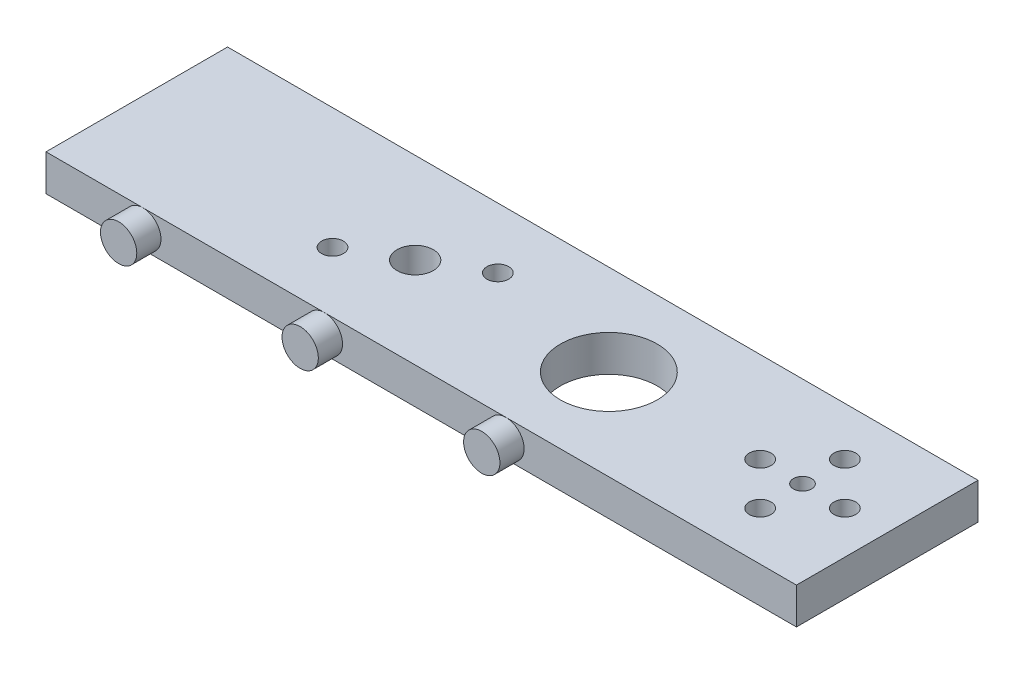
ISO-10303-21;
HEADER;
FILE_DESCRIPTION(('STEP AP214'),'2;1');
FILE_NAME('part.step','',(''),(''),'','','');
FILE_SCHEMA(('AUTOMOTIVE_DESIGN { 1 0 10303 214 1 1 1 1 }'));
ENDSEC;
DATA;
#1=APPLICATION_CONTEXT('core data for automotive mechanical design processes');
#2=APPLICATION_PROTOCOL_DEFINITION('international standard','automotive_design',2000,#1);
#3=PRODUCT_CONTEXT('',#1,'mechanical');
#4=PRODUCT('Part','Part','',(#3));
#5=PRODUCT_RELATED_PRODUCT_CATEGORY('part','',(#4));
#6=PRODUCT_DEFINITION_FORMATION('','',#4);
#7=PRODUCT_DEFINITION_CONTEXT('part definition',#1,'design');
#8=PRODUCT_DEFINITION('design','',#6,#7);
#9=PRODUCT_DEFINITION_SHAPE('','',#8);
#10=(LENGTH_UNIT() NAMED_UNIT(*) SI_UNIT(.MILLI.,.METRE.));
#11=(NAMED_UNIT(*) PLANE_ANGLE_UNIT() SI_UNIT($,.RADIAN.));
#12=(NAMED_UNIT(*) SI_UNIT($,.STERADIAN.) SOLID_ANGLE_UNIT());
#13=UNCERTAINTY_MEASURE_WITH_UNIT(LENGTH_MEASURE(1.E-05),#10,'distance_accuracy_value','');
#14=(GEOMETRIC_REPRESENTATION_CONTEXT(3) GLOBAL_UNCERTAINTY_ASSIGNED_CONTEXT((#13)) GLOBAL_UNIT_ASSIGNED_CONTEXT((#10,
#11,#12)) REPRESENTATION_CONTEXT('',''));
#15=CARTESIAN_POINT('',(0.,0.,0.));
#16=DIRECTION('',(0.,0.,1.));
#17=DIRECTION('',(1.,0.,0.));
#18=AXIS2_PLACEMENT_3D('',#15,#16,#17);
#19=CARTESIAN_POINT('',(31.,3.,7.5));
#20=DIRECTION('',(0.,0.,-1.));
#21=DIRECTION('',(-1.,0.,0.));
#22=AXIS2_PLACEMENT_3D('',#19,#20,#21);
#23=PLANE('',#22);
#24=CARTESIAN_POINT('',(-23.,1.5,7.5));
#25=DIRECTION('',(0.,0.,1.));
#26=DIRECTION('',(1.,0.,0.));
#27=AXIS2_PLACEMENT_3D('',#24,#25,#26);
#28=CIRCLE('',#27,1.5);
#29=CARTESIAN_POINT('',(-23.,3.,7.5));
#30=VERTEX_POINT('',#29);
#31=CARTESIAN_POINT('',(-23.,0.,7.5));
#32=VERTEX_POINT('',#31);
#33=EDGE_CURVE('E56',#30,#32,#28,.T.);
#34=ORIENTED_EDGE('',*,*,#33,.F.);
#35=DIRECTION('',(1.,0.,0.));
#36=VECTOR('',#35,1.);
#37=CARTESIAN_POINT('',(31.,3.,7.5));
#38=LINE('',#37,#36);
#39=CARTESIAN_POINT('',(-31.,3.,7.5));
#40=VERTEX_POINT('',#39);
#41=EDGE_CURVE('E125',#40,#30,#38,.T.);
#42=ORIENTED_EDGE('',*,*,#41,.F.);
#43=DIRECTION('',(0.,-1.,0.));
#44=VECTOR('',#43,1.);
#45=CARTESIAN_POINT('',(-31.,3.,7.5));
#46=LINE('',#45,#44);
#47=CARTESIAN_POINT('',(-31.,0.,7.5));
#48=VERTEX_POINT('',#47);
#49=EDGE_CURVE('E48',#40,#48,#46,.T.);
#50=ORIENTED_EDGE('',*,*,#49,.T.);
#51=DIRECTION('',(1.,0.,0.));
#52=VECTOR('',#51,1.);
#53=CARTESIAN_POINT('',(31.,0.,7.5));
#54=LINE('',#53,#52);
#55=EDGE_CURVE('E236',#48,#32,#54,.T.);
#56=ORIENTED_EDGE('',*,*,#55,.T.);
#57=EDGE_LOOP('',(#34,#42,#50,#56));
#58=FACE_BOUND('',#57,.T.);
#59=ADVANCED_FACE('F44',(#58),#23,.F.);
#60=EDGE_CURVE('E11',#32,#30,#28,.T.);
#61=ORIENTED_EDGE('',*,*,#60,.F.);
#62=CARTESIAN_POINT('',(-8.,0.,7.5));
#63=VERTEX_POINT('',#62);
#64=EDGE_CURVE('E241',#32,#63,#54,.T.);
#65=ORIENTED_EDGE('',*,*,#64,.T.);
#66=CARTESIAN_POINT('',(-8.,1.5,7.5));
#67=DIRECTION('',(0.,0.,1.));
#68=DIRECTION('',(1.,0.,0.));
#69=AXIS2_PLACEMENT_3D('',#66,#67,#68);
#70=CIRCLE('',#69,1.5);
#71=CARTESIAN_POINT('',(-8.,3.,7.5));
#72=VERTEX_POINT('',#71);
#73=EDGE_CURVE('E140',#72,#63,#70,.T.);
#74=ORIENTED_EDGE('',*,*,#73,.F.);
#75=EDGE_CURVE('E114',#30,#72,#38,.T.);
#76=ORIENTED_EDGE('',*,*,#75,.F.);
#77=EDGE_LOOP('',(#61,#65,#74,#76));
#78=FACE_BOUND('',#77,.T.);
#79=ADVANCED_FACE('F272',(#78),#23,.F.);
#80=EDGE_CURVE('E54',#63,#72,#70,.T.);
#81=ORIENTED_EDGE('',*,*,#80,.F.);
#82=CARTESIAN_POINT('',(7.,0.,7.5));
#83=VERTEX_POINT('',#82);
#84=EDGE_CURVE('E129',#63,#83,#54,.T.);
#85=ORIENTED_EDGE('',*,*,#84,.T.);
#86=CARTESIAN_POINT('',(7.,1.5,7.5));
#87=DIRECTION('',(0.,0.,1.));
#88=DIRECTION('',(1.,0.,0.));
#89=AXIS2_PLACEMENT_3D('',#86,#87,#88);
#90=CIRCLE('',#89,1.5);
#91=CARTESIAN_POINT('',(7.,3.,7.5));
#92=VERTEX_POINT('',#91);
#93=EDGE_CURVE('E127',#92,#83,#90,.T.);
#94=ORIENTED_EDGE('',*,*,#93,.F.);
#95=EDGE_CURVE('E107',#72,#92,#38,.T.);
#96=ORIENTED_EDGE('',*,*,#95,.F.);
#97=EDGE_LOOP('',(#81,#85,#94,#96));
#98=FACE_BOUND('',#97,.T.);
#99=ADVANCED_FACE('F128',(#98),#23,.F.);
#100=CARTESIAN_POINT('',(0.,3.,0.));
#101=DIRECTION('',(0.,-1.,0.));
#102=DIRECTION('',(0.,0.,-1.));
#103=AXIS2_PLACEMENT_3D('',#100,#101,#102);
#104=PLANE('',#103);
#105=DIRECTION('',(0.,0.,1.));
#106=VECTOR('',#105,1.);
#107=CARTESIAN_POINT('',(-31.,3.,7.5));
#108=LINE('',#107,#106);
#109=CARTESIAN_POINT('',(-31.,3.,-7.5));
#110=VERTEX_POINT('',#109);
#111=EDGE_CURVE('E124',#110,#40,#108,.T.);
#112=ORIENTED_EDGE('',*,*,#111,.T.);
#113=ORIENTED_EDGE('',*,*,#41,.T.);
#114=ORIENTED_EDGE('',*,*,#75,.T.);
#115=ORIENTED_EDGE('',*,*,#95,.T.);
#116=CARTESIAN_POINT('',(31.,3.,7.5));
#117=VERTEX_POINT('',#116);
#118=EDGE_CURVE('E111',#92,#117,#38,.T.);
#119=ORIENTED_EDGE('',*,*,#118,.T.);
#120=DIRECTION('',(0.,0.,-1.));
#121=VECTOR('',#120,1.);
#122=CARTESIAN_POINT('',(31.,3.,-7.5));
#123=LINE('',#122,#121);
#124=CARTESIAN_POINT('',(31.,3.,-7.5));
#125=VERTEX_POINT('',#124);
#126=EDGE_CURVE('E225',#117,#125,#123,.T.);
#127=ORIENTED_EDGE('',*,*,#126,.T.);
#128=DIRECTION('',(-1.,0.,0.));
#129=VECTOR('',#128,1.);
#130=CARTESIAN_POINT('',(-31.,3.,-7.5));
#131=LINE('',#130,#129);
#132=EDGE_CURVE('E228',#125,#110,#131,.T.);
#133=ORIENTED_EDGE('',*,*,#132,.T.);
#134=EDGE_LOOP('',(#112,#113,#114,#115,#119,#127,#133));
#135=FACE_BOUND('',#134,.T.);
#136=CARTESIAN_POINT('',(-8.,3.,0.));
#137=DIRECTION('',(0.,1.,0.));
#138=DIRECTION('',(0.,0.,1.));
#139=AXIS2_PLACEMENT_3D('',#136,#137,#138);
#140=CIRCLE('',#139,1.5);
#141=CARTESIAN_POINT('',(-8.,3.,1.5));
#142=VERTEX_POINT('',#141);
#143=EDGE_CURVE('E213',#142,#142,#140,.T.);
#144=ORIENTED_EDGE('',*,*,#143,.F.);
#145=EDGE_LOOP('',(#144));
#146=FACE_BOUND('',#145,.T.);
#147=CARTESIAN_POINT('',(-3.66987298107781,3.,-2.50000000000001));
#148=DIRECTION('',(0.,1.,0.));
#149=DIRECTION('',(0.,0.,1.));
#150=AXIS2_PLACEMENT_3D('',#147,#148,#149);
#151=CIRCLE('',#150,0.9);
#152=CARTESIAN_POINT('',(-3.66987298107781,3.,-1.60000000000001));
#153=VERTEX_POINT('',#152);
#154=EDGE_CURVE('E205',#153,#153,#151,.T.);
#155=ORIENTED_EDGE('',*,*,#154,.F.);
#156=EDGE_LOOP('',(#155));
#157=FACE_BOUND('',#156,.T.);
#158=CARTESIAN_POINT('',(-12.3301270189222,3.,2.50000000000001));
#159=DIRECTION('',(0.,1.,0.));
#160=DIRECTION('',(0.,0.,1.));
#161=AXIS2_PLACEMENT_3D('',#158,#159,#160);
#162=CIRCLE('',#161,0.9);
#163=CARTESIAN_POINT('',(-12.3301270189222,3.,3.40000000000001));
#164=VERTEX_POINT('',#163);
#165=EDGE_CURVE('E197',#164,#164,#162,.T.);
#166=ORIENTED_EDGE('',*,*,#165,.F.);
#167=EDGE_LOOP('',(#166));
#168=FACE_BOUND('',#167,.T.);
#169=CARTESIAN_POINT('',(8.,3.,0.));
#170=DIRECTION('',(0.,1.,0.));
#171=DIRECTION('',(0.,0.,1.));
#172=AXIS2_PLACEMENT_3D('',#169,#170,#171);
#173=CIRCLE('',#172,4.);
#174=CARTESIAN_POINT('',(8.,3.,4.));
#175=VERTEX_POINT('',#174);
#176=EDGE_CURVE('E189',#175,#175,#173,.T.);
#177=ORIENTED_EDGE('',*,*,#176,.F.);
#178=EDGE_LOOP('',(#177));
#179=FACE_BOUND('',#178,.T.);
#180=CARTESIAN_POINT('',(24.,3.,0.));
#181=DIRECTION('',(0.,1.,0.));
#182=DIRECTION('',(0.,0.,1.));
#183=AXIS2_PLACEMENT_3D('',#180,#181,#182);
#184=CIRCLE('',#183,0.750000000000002);
#185=CARTESIAN_POINT('',(24.,3.,0.750000000000002));
#186=VERTEX_POINT('',#185);
#187=EDGE_CURVE('E181',#186,#186,#184,.T.);
#188=ORIENTED_EDGE('',*,*,#187,.F.);
#189=EDGE_LOOP('',(#188));
#190=FACE_BOUND('',#189,.T.);
#191=CARTESIAN_POINT('',(27.5,3.,0.));
#192=DIRECTION('',(0.,1.,0.));
#193=DIRECTION('',(0.,0.,1.));
#194=AXIS2_PLACEMENT_3D('',#191,#192,#193);
#195=CIRCLE('',#194,0.9);
#196=CARTESIAN_POINT('',(27.5,3.,0.9));
#197=VERTEX_POINT('',#196);
#198=EDGE_CURVE('E173',#197,#197,#195,.T.);
#199=ORIENTED_EDGE('',*,*,#198,.F.);
#200=EDGE_LOOP('',(#199));
#201=FACE_BOUND('',#200,.T.);
#202=CARTESIAN_POINT('',(24.,3.,3.5));
#203=DIRECTION('',(0.,1.,0.));
#204=DIRECTION('',(0.,0.,1.));
#205=AXIS2_PLACEMENT_3D('',#202,#203,#204);
#206=CIRCLE('',#205,0.9);
#207=CARTESIAN_POINT('',(24.,3.,4.4));
#208=VERTEX_POINT('',#207);
#209=EDGE_CURVE('E165',#208,#208,#206,.T.);
#210=ORIENTED_EDGE('',*,*,#209,.F.);
#211=EDGE_LOOP('',(#210));
#212=FACE_BOUND('',#211,.T.);
#213=CARTESIAN_POINT('',(20.5,3.,0.));
#214=DIRECTION('',(0.,1.,0.));
#215=DIRECTION('',(0.,0.,1.));
#216=AXIS2_PLACEMENT_3D('',#213,#214,#215);
#217=CIRCLE('',#216,0.9);
#218=CARTESIAN_POINT('',(20.5,3.,0.900000000000001));
#219=VERTEX_POINT('',#218);
#220=EDGE_CURVE('E157',#219,#219,#217,.T.);
#221=ORIENTED_EDGE('',*,*,#220,.F.);
#222=EDGE_LOOP('',(#221));
#223=FACE_BOUND('',#222,.T.);
#224=CARTESIAN_POINT('',(24.,3.,-3.5));
#225=DIRECTION('',(0.,1.,0.));
#226=DIRECTION('',(0.,0.,1.));
#227=AXIS2_PLACEMENT_3D('',#224,#225,#226);
#228=CIRCLE('',#227,0.9);
#229=CARTESIAN_POINT('',(24.,3.,-2.6));
#230=VERTEX_POINT('',#229);
#231=EDGE_CURVE('E147',#230,#230,#228,.T.);
#232=ORIENTED_EDGE('',*,*,#231,.F.);
#233=EDGE_LOOP('',(#232));
#234=FACE_BOUND('',#233,.T.);
#235=ADVANCED_FACE('F109',(#135,#146,#157,#168,#179,#190,#201,#212,#223,#234),#104,.F.);
#236=CARTESIAN_POINT('',(0.,0.,0.));
#237=DIRECTION('',(0.,-1.,0.));
#238=DIRECTION('',(0.,0.,-1.));
#239=AXIS2_PLACEMENT_3D('',#236,#237,#238);
#240=PLANE('',#239);
#241=CARTESIAN_POINT('',(20.5,0.,0.));
#242=DIRECTION('',(0.,1.,0.));
#243=DIRECTION('',(0.,0.,1.));
#244=AXIS2_PLACEMENT_3D('',#241,#242,#243);
#245=CIRCLE('',#244,0.9);
#246=CARTESIAN_POINT('',(20.5,0.,0.900000000000001));
#247=VERTEX_POINT('',#246);
#248=EDGE_CURVE('E151',#247,#247,#245,.T.);
#249=ORIENTED_EDGE('',*,*,#248,.T.);
#250=EDGE_LOOP('',(#249));
#251=FACE_BOUND('',#250,.T.);
#252=CARTESIAN_POINT('',(27.5,0.,0.));
#253=DIRECTION('',(0.,1.,0.));
#254=DIRECTION('',(0.,0.,1.));
#255=AXIS2_PLACEMENT_3D('',#252,#253,#254);
#256=CIRCLE('',#255,0.9);
#257=CARTESIAN_POINT('',(27.5,0.,0.9));
#258=VERTEX_POINT('',#257);
#259=EDGE_CURVE('E169',#258,#258,#256,.T.);
#260=ORIENTED_EDGE('',*,*,#259,.T.);
#261=EDGE_LOOP('',(#260));
#262=FACE_BOUND('',#261,.T.);
#263=CARTESIAN_POINT('',(8.,0.,0.));
#264=DIRECTION('',(0.,1.,0.));
#265=DIRECTION('',(0.,0.,1.));
#266=AXIS2_PLACEMENT_3D('',#263,#264,#265);
#267=CIRCLE('',#266,4.);
#268=CARTESIAN_POINT('',(8.,0.,4.));
#269=VERTEX_POINT('',#268);
#270=EDGE_CURVE('E185',#269,#269,#267,.T.);
#271=ORIENTED_EDGE('',*,*,#270,.T.);
#272=EDGE_LOOP('',(#271));
#273=FACE_BOUND('',#272,.T.);
#274=CARTESIAN_POINT('',(-3.66987298107781,0.,-2.50000000000001));
#275=DIRECTION('',(0.,1.,0.));
#276=DIRECTION('',(0.,0.,1.));
#277=AXIS2_PLACEMENT_3D('',#274,#275,#276);
#278=CIRCLE('',#277,0.9);
#279=CARTESIAN_POINT('',(-3.66987298107781,0.,-1.60000000000001));
#280=VERTEX_POINT('',#279);
#281=EDGE_CURVE('E201',#280,#280,#278,.T.);
#282=ORIENTED_EDGE('',*,*,#281,.T.);
#283=EDGE_LOOP('',(#282));
#284=FACE_BOUND('',#283,.T.);
#285=DIRECTION('',(0.,0.,1.));
#286=VECTOR('',#285,1.);
#287=CARTESIAN_POINT('',(-31.,0.,7.5));
#288=LINE('',#287,#286);
#289=CARTESIAN_POINT('',(-31.,0.,-7.5));
#290=VERTEX_POINT('',#289);
#291=EDGE_CURVE('E217',#290,#48,#288,.T.);
#292=ORIENTED_EDGE('',*,*,#291,.F.);
#293=DIRECTION('',(-1.,0.,0.));
#294=VECTOR('',#293,1.);
#295=CARTESIAN_POINT('',(-31.,0.,-7.5));
#296=LINE('',#295,#294);
#297=CARTESIAN_POINT('',(31.,0.,-7.5));
#298=VERTEX_POINT('',#297);
#299=EDGE_CURVE('E222',#298,#290,#296,.T.);
#300=ORIENTED_EDGE('',*,*,#299,.F.);
#301=DIRECTION('',(0.,0.,-1.));
#302=VECTOR('',#301,1.);
#303=CARTESIAN_POINT('',(31.,0.,-7.5));
#304=LINE('',#303,#302);
#305=CARTESIAN_POINT('',(31.,0.,7.5));
#306=VERTEX_POINT('',#305);
#307=EDGE_CURVE('E240',#306,#298,#304,.T.);
#308=ORIENTED_EDGE('',*,*,#307,.F.);
#309=EDGE_CURVE('E235',#83,#306,#54,.T.);
#310=ORIENTED_EDGE('',*,*,#309,.F.);
#311=ORIENTED_EDGE('',*,*,#84,.F.);
#312=ORIENTED_EDGE('',*,*,#64,.F.);
#313=ORIENTED_EDGE('',*,*,#55,.F.);
#314=EDGE_LOOP('',(#292,#300,#308,#310,#311,#312,#313));
#315=FACE_BOUND('',#314,.T.);
#316=CARTESIAN_POINT('',(-8.,0.,0.));
#317=DIRECTION('',(0.,1.,0.));
#318=DIRECTION('',(0.,0.,1.));
#319=AXIS2_PLACEMENT_3D('',#316,#317,#318);
#320=CIRCLE('',#319,1.5);
#321=CARTESIAN_POINT('',(-8.,0.,1.5));
#322=VERTEX_POINT('',#321);
#323=EDGE_CURVE('E209',#322,#322,#320,.T.);
#324=ORIENTED_EDGE('',*,*,#323,.T.);
#325=EDGE_LOOP('',(#324));
#326=FACE_BOUND('',#325,.T.);
#327=CARTESIAN_POINT('',(-12.3301270189222,0.,2.50000000000001));
#328=DIRECTION('',(0.,1.,0.));
#329=DIRECTION('',(0.,0.,1.));
#330=AXIS2_PLACEMENT_3D('',#327,#328,#329);
#331=CIRCLE('',#330,0.9);
#332=CARTESIAN_POINT('',(-12.3301270189222,0.,3.40000000000001));
#333=VERTEX_POINT('',#332);
#334=EDGE_CURVE('E193',#333,#333,#331,.T.);
#335=ORIENTED_EDGE('',*,*,#334,.T.);
#336=EDGE_LOOP('',(#335));
#337=FACE_BOUND('',#336,.T.);
#338=CARTESIAN_POINT('',(24.,0.,0.));
#339=DIRECTION('',(0.,1.,0.));
#340=DIRECTION('',(0.,0.,1.));
#341=AXIS2_PLACEMENT_3D('',#338,#339,#340);
#342=CIRCLE('',#341,0.750000000000002);
#343=CARTESIAN_POINT('',(24.,0.,0.750000000000002));
#344=VERTEX_POINT('',#343);
#345=EDGE_CURVE('E177',#344,#344,#342,.T.);
#346=ORIENTED_EDGE('',*,*,#345,.T.);
#347=EDGE_LOOP('',(#346));
#348=FACE_BOUND('',#347,.T.);
#349=CARTESIAN_POINT('',(24.,0.,3.5));
#350=DIRECTION('',(0.,1.,0.));
#351=DIRECTION('',(0.,0.,1.));
#352=AXIS2_PLACEMENT_3D('',#349,#350,#351);
#353=CIRCLE('',#352,0.9);
#354=CARTESIAN_POINT('',(24.,0.,4.4));
#355=VERTEX_POINT('',#354);
#356=EDGE_CURVE('E161',#355,#355,#353,.T.);
#357=ORIENTED_EDGE('',*,*,#356,.T.);
#358=EDGE_LOOP('',(#357));
#359=FACE_BOUND('',#358,.T.);
#360=CARTESIAN_POINT('',(24.,0.,-3.5));
#361=DIRECTION('',(0.,1.,0.));
#362=DIRECTION('',(0.,0.,1.));
#363=AXIS2_PLACEMENT_3D('',#360,#361,#362);
#364=CIRCLE('',#363,0.9);
#365=CARTESIAN_POINT('',(24.,0.,-2.6));
#366=VERTEX_POINT('',#365);
#367=EDGE_CURVE('E152',#366,#366,#364,.T.);
#368=ORIENTED_EDGE('',*,*,#367,.T.);
#369=EDGE_LOOP('',(#368));
#370=FACE_BOUND('',#369,.T.);
#371=ADVANCED_FACE('F260',(#251,#262,#273,#284,#315,#326,#337,#348,#359,#370),#240,.T.);
#372=CARTESIAN_POINT('',(-31.,3.,7.5));
#373=DIRECTION('',(1.,0.,0.));
#374=DIRECTION('',(0.,0.,-1.));
#375=AXIS2_PLACEMENT_3D('',#372,#373,#374);
#376=PLANE('',#375);
#377=ORIENTED_EDGE('',*,*,#291,.T.);
#378=ORIENTED_EDGE('',*,*,#49,.F.);
#379=ORIENTED_EDGE('',*,*,#111,.F.);
#380=DIRECTION('',(0.,-1.,0.));
#381=VECTOR('',#380,1.);
#382=CARTESIAN_POINT('',(-31.,3.,-7.5));
#383=LINE('',#382,#381);
#384=EDGE_CURVE('E231',#110,#290,#383,.T.);
#385=ORIENTED_EDGE('',*,*,#384,.T.);
#386=EDGE_LOOP('',(#377,#378,#379,#385));
#387=FACE_BOUND('',#386,.T.);
#388=ADVANCED_FACE('F46',(#387),#376,.F.);
#389=EDGE_CURVE('E63',#83,#92,#90,.T.);
#390=ORIENTED_EDGE('',*,*,#389,.F.);
#391=ORIENTED_EDGE('',*,*,#309,.T.);
#392=DIRECTION('',(0.,-1.,0.));
#393=VECTOR('',#392,1.);
#394=CARTESIAN_POINT('',(31.,3.,7.5));
#395=LINE('',#394,#393);
#396=EDGE_CURVE('E121',#117,#306,#395,.T.);
#397=ORIENTED_EDGE('',*,*,#396,.F.);
#398=ORIENTED_EDGE('',*,*,#118,.F.);
#399=EDGE_LOOP('',(#390,#391,#397,#398));
#400=FACE_BOUND('',#399,.T.);
#401=ADVANCED_FACE('F119',(#400),#23,.F.);
#402=CARTESIAN_POINT('',(31.,3.,-7.5));
#403=DIRECTION('',(-1.,0.,0.));
#404=DIRECTION('',(0.,0.,1.));
#405=AXIS2_PLACEMENT_3D('',#402,#403,#404);
#406=PLANE('',#405);
#407=ORIENTED_EDGE('',*,*,#307,.T.);
#408=DIRECTION('',(0.,-1.,0.));
#409=VECTOR('',#408,1.);
#410=CARTESIAN_POINT('',(31.,3.,-7.5));
#411=LINE('',#410,#409);
#412=EDGE_CURVE('E249',#125,#298,#411,.T.);
#413=ORIENTED_EDGE('',*,*,#412,.F.);
#414=ORIENTED_EDGE('',*,*,#126,.F.);
#415=ORIENTED_EDGE('',*,*,#396,.T.);
#416=EDGE_LOOP('',(#407,#413,#414,#415));
#417=FACE_BOUND('',#416,.T.);
#418=ADVANCED_FACE('F255',(#417),#406,.F.);
#419=CARTESIAN_POINT('',(-31.,3.,-7.5));
#420=DIRECTION('',(0.,0.,1.));
#421=DIRECTION('',(1.,0.,0.));
#422=AXIS2_PLACEMENT_3D('',#419,#420,#421);
#423=PLANE('',#422);
#424=ORIENTED_EDGE('',*,*,#299,.T.);
#425=ORIENTED_EDGE('',*,*,#384,.F.);
#426=ORIENTED_EDGE('',*,*,#132,.F.);
#427=ORIENTED_EDGE('',*,*,#412,.T.);
#428=EDGE_LOOP('',(#424,#425,#426,#427));
#429=FACE_BOUND('',#428,.T.);
#430=ADVANCED_FACE('F264',(#429),#423,.F.);
#431=CARTESIAN_POINT('',(-8.,3.,0.));
#432=DIRECTION('',(0.,-1.,0.));
#433=DIRECTION('',(0.,0.,-1.));
#434=AXIS2_PLACEMENT_3D('',#431,#432,#433);
#435=CYLINDRICAL_SURFACE('',#434,1.5);
#436=ORIENTED_EDGE('',*,*,#143,.T.);
#437=EDGE_LOOP('',(#436));
#438=FACE_BOUND('',#437,.T.);
#439=ORIENTED_EDGE('',*,*,#323,.F.);
#440=EDGE_LOOP('',(#439));
#441=FACE_BOUND('',#440,.T.);
#442=ADVANCED_FACE('F320',(#438,#441),#435,.F.);
#443=CARTESIAN_POINT('',(-3.66987298107781,3.,-2.50000000000001));
#444=DIRECTION('',(0.,-1.,0.));
#445=DIRECTION('',(0.,0.,-1.));
#446=AXIS2_PLACEMENT_3D('',#443,#444,#445);
#447=CYLINDRICAL_SURFACE('',#446,0.9);
#448=ORIENTED_EDGE('',*,*,#154,.T.);
#449=EDGE_LOOP('',(#448));
#450=FACE_BOUND('',#449,.T.);
#451=ORIENTED_EDGE('',*,*,#281,.F.);
#452=EDGE_LOOP('',(#451));
#453=FACE_BOUND('',#452,.T.);
#454=ADVANCED_FACE('F327',(#450,#453),#447,.F.);
#455=CARTESIAN_POINT('',(-12.3301270189222,3.,2.50000000000001));
#456=DIRECTION('',(0.,-1.,0.));
#457=DIRECTION('',(0.,0.,-1.));
#458=AXIS2_PLACEMENT_3D('',#455,#456,#457);
#459=CYLINDRICAL_SURFACE('',#458,0.9);
#460=ORIENTED_EDGE('',*,*,#165,.T.);
#461=EDGE_LOOP('',(#460));
#462=FACE_BOUND('',#461,.T.);
#463=ORIENTED_EDGE('',*,*,#334,.F.);
#464=EDGE_LOOP('',(#463));
#465=FACE_BOUND('',#464,.T.);
#466=ADVANCED_FACE('F332',(#462,#465),#459,.F.);
#467=CARTESIAN_POINT('',(8.,3.,0.));
#468=DIRECTION('',(0.,-1.,0.));
#469=DIRECTION('',(0.,0.,-1.));
#470=AXIS2_PLACEMENT_3D('',#467,#468,#469);
#471=CYLINDRICAL_SURFACE('',#470,4.);
#472=ORIENTED_EDGE('',*,*,#176,.T.);
#473=EDGE_LOOP('',(#472));
#474=FACE_BOUND('',#473,.T.);
#475=ORIENTED_EDGE('',*,*,#270,.F.);
#476=EDGE_LOOP('',(#475));
#477=FACE_BOUND('',#476,.T.);
#478=ADVANCED_FACE('F371',(#474,#477),#471,.F.);
#479=CARTESIAN_POINT('',(24.,3.,0.));
#480=DIRECTION('',(0.,-1.,0.));
#481=DIRECTION('',(0.,0.,-1.));
#482=AXIS2_PLACEMENT_3D('',#479,#480,#481);
#483=CYLINDRICAL_SURFACE('',#482,0.750000000000002);
#484=ORIENTED_EDGE('',*,*,#187,.T.);
#485=EDGE_LOOP('',(#484));
#486=FACE_BOUND('',#485,.T.);
#487=ORIENTED_EDGE('',*,*,#345,.F.);
#488=EDGE_LOOP('',(#487));
#489=FACE_BOUND('',#488,.T.);
#490=ADVANCED_FACE('F367',(#486,#489),#483,.F.);
#491=CARTESIAN_POINT('',(27.5,3.,0.));
#492=DIRECTION('',(0.,-1.,0.));
#493=DIRECTION('',(0.,0.,-1.));
#494=AXIS2_PLACEMENT_3D('',#491,#492,#493);
#495=CYLINDRICAL_SURFACE('',#494,0.9);
#496=ORIENTED_EDGE('',*,*,#198,.T.);
#497=EDGE_LOOP('',(#496));
#498=FACE_BOUND('',#497,.T.);
#499=ORIENTED_EDGE('',*,*,#259,.F.);
#500=EDGE_LOOP('',(#499));
#501=FACE_BOUND('',#500,.T.);
#502=ADVANCED_FACE('F363',(#498,#501),#495,.F.);
#503=CARTESIAN_POINT('',(24.,3.,3.5));
#504=DIRECTION('',(0.,-1.,0.));
#505=DIRECTION('',(0.,0.,-1.));
#506=AXIS2_PLACEMENT_3D('',#503,#504,#505);
#507=CYLINDRICAL_SURFACE('',#506,0.9);
#508=ORIENTED_EDGE('',*,*,#209,.T.);
#509=EDGE_LOOP('',(#508));
#510=FACE_BOUND('',#509,.T.);
#511=ORIENTED_EDGE('',*,*,#356,.F.);
#512=EDGE_LOOP('',(#511));
#513=FACE_BOUND('',#512,.T.);
#514=ADVANCED_FACE('F356',(#510,#513),#507,.F.);
#515=CARTESIAN_POINT('',(20.5,3.,0.));
#516=DIRECTION('',(0.,-1.,0.));
#517=DIRECTION('',(0.,0.,-1.));
#518=AXIS2_PLACEMENT_3D('',#515,#516,#517);
#519=CYLINDRICAL_SURFACE('',#518,0.9);
#520=ORIENTED_EDGE('',*,*,#220,.T.);
#521=EDGE_LOOP('',(#520));
#522=FACE_BOUND('',#521,.T.);
#523=ORIENTED_EDGE('',*,*,#248,.F.);
#524=EDGE_LOOP('',(#523));
#525=FACE_BOUND('',#524,.T.);
#526=ADVANCED_FACE('F347',(#522,#525),#519,.F.);
#527=CARTESIAN_POINT('',(24.,3.,-3.5));
#528=DIRECTION('',(0.,-1.,0.));
#529=DIRECTION('',(0.,0.,-1.));
#530=AXIS2_PLACEMENT_3D('',#527,#528,#529);
#531=CYLINDRICAL_SURFACE('',#530,0.9);
#532=ORIENTED_EDGE('',*,*,#231,.T.);
#533=EDGE_LOOP('',(#532));
#534=FACE_BOUND('',#533,.T.);
#535=ORIENTED_EDGE('',*,*,#367,.F.);
#536=EDGE_LOOP('',(#535));
#537=FACE_BOUND('',#536,.T.);
#538=ADVANCED_FACE('F346',(#534,#537),#531,.F.);
#539=CARTESIAN_POINT('',(7.,1.5,9.5));
#540=DIRECTION('',(0.,0.,-1.));
#541=DIRECTION('',(-1.,0.,0.));
#542=AXIS2_PLACEMENT_3D('',#539,#540,#541);
#543=CYLINDRICAL_SURFACE('',#542,1.5);
#544=CARTESIAN_POINT('',(7.,1.5,9.5));
#545=DIRECTION('',(0.,0.,1.));
#546=DIRECTION('',(1.,0.,0.));
#547=AXIS2_PLACEMENT_3D('',#544,#545,#546);
#548=CIRCLE('',#547,1.5);
#549=CARTESIAN_POINT('',(8.5,1.5,9.5));
#550=VERTEX_POINT('',#549);
#551=EDGE_CURVE('E133',#550,#550,#548,.T.);
#552=ORIENTED_EDGE('',*,*,#551,.F.);
#553=EDGE_LOOP('',(#552));
#554=FACE_BOUND('',#553,.T.);
#555=ORIENTED_EDGE('',*,*,#93,.T.);
#556=ORIENTED_EDGE('',*,*,#389,.T.);
#557=EDGE_LOOP('',(#555,#556));
#558=FACE_BOUND('',#557,.T.);
#559=ADVANCED_FACE('F135',(#554,#558),#543,.T.);
#560=CARTESIAN_POINT('',(7.,1.5,9.5));
#561=DIRECTION('',(0.,0.,1.));
#562=DIRECTION('',(1.,0.,0.));
#563=AXIS2_PLACEMENT_3D('',#560,#561,#562);
#564=PLANE('',#563);
#565=ORIENTED_EDGE('',*,*,#551,.T.);
#566=EDGE_LOOP('',(#565));
#567=FACE_BOUND('',#566,.T.);
#568=ADVANCED_FACE('F353',(#567),#564,.T.);
#569=CARTESIAN_POINT('',(-8.,1.5,9.5));
#570=DIRECTION('',(0.,0.,-1.));
#571=DIRECTION('',(-1.,0.,0.));
#572=AXIS2_PLACEMENT_3D('',#569,#570,#571);
#573=CYLINDRICAL_SURFACE('',#572,1.5);
#574=CARTESIAN_POINT('',(-8.,1.5,9.5));
#575=DIRECTION('',(0.,0.,1.));
#576=DIRECTION('',(1.,0.,0.));
#577=AXIS2_PLACEMENT_3D('',#574,#575,#576);
#578=CIRCLE('',#577,1.5);
#579=CARTESIAN_POINT('',(-6.5,1.5,9.5));
#580=VERTEX_POINT('',#579);
#581=EDGE_CURVE('E132',#580,#580,#578,.T.);
#582=ORIENTED_EDGE('',*,*,#581,.F.);
#583=EDGE_LOOP('',(#582));
#584=FACE_BOUND('',#583,.T.);
#585=ORIENTED_EDGE('',*,*,#73,.T.);
#586=ORIENTED_EDGE('',*,*,#80,.T.);
#587=EDGE_LOOP('',(#585,#586));
#588=FACE_BOUND('',#587,.T.);
#589=ADVANCED_FACE('F292',(#584,#588),#573,.T.);
#590=CARTESIAN_POINT('',(-8.,1.5,9.5));
#591=DIRECTION('',(0.,0.,1.));
#592=DIRECTION('',(1.,0.,0.));
#593=AXIS2_PLACEMENT_3D('',#590,#591,#592);
#594=PLANE('',#593);
#595=ORIENTED_EDGE('',*,*,#581,.T.);
#596=EDGE_LOOP('',(#595));
#597=FACE_BOUND('',#596,.T.);
#598=ADVANCED_FACE('F283',(#597),#594,.T.);
#599=CARTESIAN_POINT('',(-23.,1.5,9.5));
#600=DIRECTION('',(0.,0.,-1.));
#601=DIRECTION('',(-1.,0.,0.));
#602=AXIS2_PLACEMENT_3D('',#599,#600,#601);
#603=CYLINDRICAL_SURFACE('',#602,1.5);
#604=CARTESIAN_POINT('',(-23.,1.5,9.5));
#605=DIRECTION('',(0.,0.,1.));
#606=DIRECTION('',(1.,0.,0.));
#607=AXIS2_PLACEMENT_3D('',#604,#605,#606);
#608=CIRCLE('',#607,1.5);
#609=CARTESIAN_POINT('',(-21.5,1.5,9.5));
#610=VERTEX_POINT('',#609);
#611=EDGE_CURVE('E156',#610,#610,#608,.T.);
#612=ORIENTED_EDGE('',*,*,#611,.F.);
#613=EDGE_LOOP('',(#612));
#614=FACE_BOUND('',#613,.T.);
#615=ORIENTED_EDGE('',*,*,#33,.T.);
#616=ORIENTED_EDGE('',*,*,#60,.T.);
#617=EDGE_LOOP('',(#615,#616));
#618=FACE_BOUND('',#617,.T.);
#619=ADVANCED_FACE('F280',(#614,#618),#603,.T.);
#620=CARTESIAN_POINT('',(-23.,1.5,9.5));
#621=DIRECTION('',(0.,0.,1.));
#622=DIRECTION('',(1.,0.,0.));
#623=AXIS2_PLACEMENT_3D('',#620,#621,#622);
#624=PLANE('',#623);
#625=ORIENTED_EDGE('',*,*,#611,.T.);
#626=EDGE_LOOP('',(#625));
#627=FACE_BOUND('',#626,.T.);
#628=ADVANCED_FACE('F282',(#627),#624,.T.);
#629=CLOSED_SHELL('',(#59,#79,#99,#235,#371,#388,#401,#418,#430,#442,#454,#466,#478,#490,#502,
#514,#526,#538,#559,#568,#589,#598,#619,#628));
#630=MANIFOLD_SOLID_BREP('B2',#629);
#631=ADVANCED_BREP_SHAPE_REPRESENTATION('',(#18,#630),#14);
#632=SHAPE_DEFINITION_REPRESENTATION(#9,#631);
ENDSEC;
END-ISO-10303-21;
